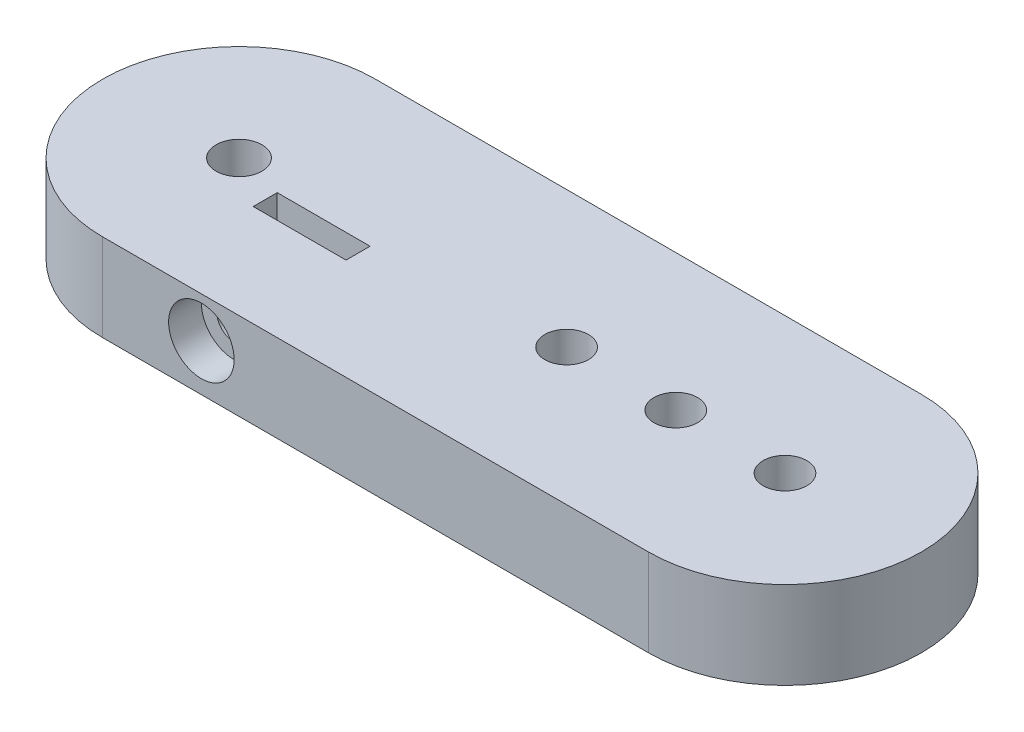
ISO-10303-21;
HEADER;
FILE_DESCRIPTION(('STEP AP214'),'2;1');
FILE_NAME('part.step','',(''),(''),'','','');
FILE_SCHEMA(('AUTOMOTIVE_DESIGN { 1 0 10303 214 1 1 1 1 }'));
ENDSEC;
DATA;
#1=APPLICATION_CONTEXT('core data for automotive mechanical design processes');
#2=APPLICATION_PROTOCOL_DEFINITION('international standard','automotive_design',2000,#1);
#3=PRODUCT_CONTEXT('',#1,'mechanical');
#4=PRODUCT('Part','Part','',(#3));
#5=PRODUCT_RELATED_PRODUCT_CATEGORY('part','',(#4));
#6=PRODUCT_DEFINITION_FORMATION('','',#4);
#7=PRODUCT_DEFINITION_CONTEXT('part definition',#1,'design');
#8=PRODUCT_DEFINITION('design','',#6,#7);
#9=PRODUCT_DEFINITION_SHAPE('','',#8);
#10=(LENGTH_UNIT() NAMED_UNIT(*) SI_UNIT(.MILLI.,.METRE.));
#11=(NAMED_UNIT(*) PLANE_ANGLE_UNIT() SI_UNIT($,.RADIAN.));
#12=(NAMED_UNIT(*) SI_UNIT($,.STERADIAN.) SOLID_ANGLE_UNIT());
#13=UNCERTAINTY_MEASURE_WITH_UNIT(LENGTH_MEASURE(1.E-05),#10,'distance_accuracy_value','');
#14=(GEOMETRIC_REPRESENTATION_CONTEXT(3) GLOBAL_UNCERTAINTY_ASSIGNED_CONTEXT((#13)) GLOBAL_UNIT_ASSIGNED_CONTEXT((#10,
#11,#12)) REPRESENTATION_CONTEXT('',''));
#15=CARTESIAN_POINT('',(0.,0.,0.));
#16=DIRECTION('',(0.,0.,1.));
#17=DIRECTION('',(1.,0.,0.));
#18=AXIS2_PLACEMENT_3D('',#15,#16,#17);
#19=CARTESIAN_POINT('',(9.05188348592834,4.27144827372672,2.5));
#20=DIRECTION('',(0.,0.,1.));
#21=DIRECTION('',(1.,0.,0.));
#22=AXIS2_PLACEMENT_3D('',#19,#20,#21);
#23=CYLINDRICAL_SURFACE('',#22,1.6);
#24=CARTESIAN_POINT('',(9.05188348592834,4.27144827372672,3.2));
#25=DIRECTION('',(0.,0.,-1.));
#26=DIRECTION('',(-1.,0.,0.));
#27=AXIS2_PLACEMENT_3D('',#24,#25,#26);
#28=CIRCLE('',#27,1.6);
#29=CARTESIAN_POINT('',(7.45188348592833,4.27144827372672,3.2));
#30=VERTEX_POINT('',#29);
#31=EDGE_CURVE('E202',#30,#30,#28,.T.);
#32=ORIENTED_EDGE('',*,*,#31,.T.);
#33=EDGE_LOOP('',(#32));
#34=FACE_BOUND('',#33,.T.);
#35=CARTESIAN_POINT('',(9.05188348592834,4.27144827372672,9.5));
#36=DIRECTION('',(0.,0.,1.));
#37=DIRECTION('',(1.,0.,0.));
#38=AXIS2_PLACEMENT_3D('',#35,#36,#37);
#39=CIRCLE('',#38,1.6);
#40=CARTESIAN_POINT('',(10.6518834859283,4.27144827372672,9.5));
#41=VERTEX_POINT('',#40);
#42=EDGE_CURVE('E43',#41,#41,#39,.F.);
#43=ORIENTED_EDGE('',*,*,#42,.F.);
#44=EDGE_LOOP('',(#43));
#45=FACE_BOUND('',#44,.T.);
#46=ADVANCED_FACE('F39',(#34,#45),#23,.F.);
#47=CARTESIAN_POINT('',(0.,8.,0.));
#48=DIRECTION('',(0.,1.,0.));
#49=DIRECTION('',(0.,0.,1.));
#50=AXIS2_PLACEMENT_3D('',#47,#48,#49);
#51=PLANE('',#50);
#52=CARTESIAN_POINT('',(30.,8.,0.));
#53=DIRECTION('',(0.,1.,0.));
#54=DIRECTION('',(0.,0.,1.));
#55=AXIS2_PLACEMENT_3D('',#52,#53,#54);
#56=CIRCLE('',#55,2.);
#57=CARTESIAN_POINT('',(30.,8.,2.));
#58=VERTEX_POINT('',#57);
#59=EDGE_CURVE('E205',#58,#58,#56,.T.);
#60=ORIENTED_EDGE('',*,*,#59,.F.);
#61=EDGE_LOOP('',(#60));
#62=FACE_BOUND('',#61,.T.);
#63=CARTESIAN_POINT('',(40.,8.,0.));
#64=DIRECTION('',(0.,1.,0.));
#65=DIRECTION('',(0.,0.,1.));
#66=AXIS2_PLACEMENT_3D('',#63,#64,#65);
#67=CIRCLE('',#66,2.);
#68=CARTESIAN_POINT('',(40.,8.,2.));
#69=VERTEX_POINT('',#68);
#70=EDGE_CURVE('E229',#69,#69,#67,.T.);
#71=ORIENTED_EDGE('',*,*,#70,.F.);
#72=EDGE_LOOP('',(#71));
#73=FACE_BOUND('',#72,.T.);
#74=DIRECTION('',(0.,0.,1.));
#75=VECTOR('',#74,1.);
#76=CARTESIAN_POINT('',(4.5,8.,3.2));
#77=LINE('',#76,#75);
#78=CARTESIAN_POINT('',(4.5,8.,1.));
#79=VERTEX_POINT('',#78);
#80=CARTESIAN_POINT('',(4.5,8.,3.2));
#81=VERTEX_POINT('',#80);
#82=EDGE_CURVE('E116',#79,#81,#77,.T.);
#83=ORIENTED_EDGE('',*,*,#82,.F.);
#84=DIRECTION('',(-1.,0.,0.));
#85=VECTOR('',#84,1.);
#86=CARTESIAN_POINT('',(4.5,8.,1.));
#87=LINE('',#86,#85);
#88=CARTESIAN_POINT('',(13.,8.,1.));
#89=VERTEX_POINT('',#88);
#90=EDGE_CURVE('E107',#89,#79,#87,.T.);
#91=ORIENTED_EDGE('',*,*,#90,.F.);
#92=DIRECTION('',(0.,0.,-1.));
#93=VECTOR('',#92,1.);
#94=CARTESIAN_POINT('',(13.,8.,1.));
#95=LINE('',#94,#93);
#96=CARTESIAN_POINT('',(13.,8.,3.2));
#97=VERTEX_POINT('',#96);
#98=EDGE_CURVE('E135',#97,#89,#95,.T.);
#99=ORIENTED_EDGE('',*,*,#98,.F.);
#100=DIRECTION('',(1.,0.,0.));
#101=VECTOR('',#100,1.);
#102=CARTESIAN_POINT('',(4.5,8.,3.2));
#103=LINE('',#102,#101);
#104=EDGE_CURVE('E131',#81,#97,#103,.T.);
#105=ORIENTED_EDGE('',*,*,#104,.F.);
#106=EDGE_LOOP('',(#83,#91,#99,#105));
#107=FACE_BOUND('',#106,.T.);
#108=CARTESIAN_POINT('',(0.,8.,0.));
#109=DIRECTION('',(0.,1.,0.));
#110=DIRECTION('',(0.,0.,1.));
#111=AXIS2_PLACEMENT_3D('',#108,#109,#110);
#112=CIRCLE('',#111,2.1);
#113=CARTESIAN_POINT('',(0.,8.,2.1));
#114=VERTEX_POINT('',#113);
#115=EDGE_CURVE('E159',#114,#114,#112,.T.);
#116=ORIENTED_EDGE('',*,*,#115,.F.);
#117=EDGE_LOOP('',(#116));
#118=FACE_BOUND('',#117,.T.);
#119=CARTESIAN_POINT('',(0.,8.,0.));
#120=DIRECTION('',(0.,1.,0.));
#121=DIRECTION('',(0.,0.,1.));
#122=AXIS2_PLACEMENT_3D('',#119,#120,#121);
#123=CIRCLE('',#122,12.5);
#124=CARTESIAN_POINT('',(0.,8.,-12.5));
#125=VERTEX_POINT('',#124);
#126=CARTESIAN_POINT('',(0.,8.,12.5));
#127=VERTEX_POINT('',#126);
#128=EDGE_CURVE('E167',#125,#127,#123,.T.);
#129=ORIENTED_EDGE('',*,*,#128,.T.);
#130=DIRECTION('',(1.,0.,0.));
#131=VECTOR('',#130,1.);
#132=CARTESIAN_POINT('',(0.,8.,12.5));
#133=LINE('',#132,#131);
#134=CARTESIAN_POINT('',(50.,8.,12.5));
#135=VERTEX_POINT('',#134);
#136=EDGE_CURVE('E171',#127,#135,#133,.T.);
#137=ORIENTED_EDGE('',*,*,#136,.T.);
#138=CARTESIAN_POINT('',(50.,8.,0.));
#139=DIRECTION('',(0.,1.,0.));
#140=DIRECTION('',(0.,0.,1.));
#141=AXIS2_PLACEMENT_3D('',#138,#139,#140);
#142=CIRCLE('',#141,12.5);
#143=CARTESIAN_POINT('',(50.,8.,-12.5));
#144=VERTEX_POINT('',#143);
#145=EDGE_CURVE('E175',#135,#144,#142,.T.);
#146=ORIENTED_EDGE('',*,*,#145,.T.);
#147=DIRECTION('',(-1.,0.,0.));
#148=VECTOR('',#147,1.);
#149=CARTESIAN_POINT('',(0.,8.,-12.5));
#150=LINE('',#149,#148);
#151=EDGE_CURVE('E178',#144,#125,#150,.T.);
#152=ORIENTED_EDGE('',*,*,#151,.T.);
#153=EDGE_LOOP('',(#129,#137,#146,#152));
#154=FACE_BOUND('',#153,.T.);
#155=CARTESIAN_POINT('',(50.,8.,0.));
#156=DIRECTION('',(0.,1.,0.));
#157=DIRECTION('',(0.,0.,1.));
#158=AXIS2_PLACEMENT_3D('',#155,#156,#157);
#159=CIRCLE('',#158,2.);
#160=CARTESIAN_POINT('',(50.,8.,2.));
#161=VERTEX_POINT('',#160);
#162=EDGE_CURVE('E143',#161,#161,#159,.T.);
#163=ORIENTED_EDGE('',*,*,#162,.F.);
#164=EDGE_LOOP('',(#163));
#165=FACE_BOUND('',#164,.T.);
#166=ADVANCED_FACE('F129',(#62,#73,#107,#118,#154,#165),#51,.T.);
#167=CARTESIAN_POINT('',(0.,0.,0.));
#168=DIRECTION('',(0.,1.,0.));
#169=DIRECTION('',(0.,0.,1.));
#170=AXIS2_PLACEMENT_3D('',#167,#168,#169);
#171=PLANE('',#170);
#172=CARTESIAN_POINT('',(30.,0.,0.));
#173=DIRECTION('',(0.,1.,0.));
#174=DIRECTION('',(0.,0.,1.));
#175=AXIS2_PLACEMENT_3D('',#172,#173,#174);
#176=CIRCLE('',#175,2.);
#177=CARTESIAN_POINT('',(30.,0.,2.));
#178=VERTEX_POINT('',#177);
#179=EDGE_CURVE('E211',#178,#178,#176,.T.);
#180=ORIENTED_EDGE('',*,*,#179,.T.);
#181=EDGE_LOOP('',(#180));
#182=FACE_BOUND('',#181,.T.);
#183=CARTESIAN_POINT('',(40.,0.,0.));
#184=DIRECTION('',(0.,1.,0.));
#185=DIRECTION('',(0.,0.,1.));
#186=AXIS2_PLACEMENT_3D('',#183,#184,#185);
#187=CIRCLE('',#186,2.);
#188=CARTESIAN_POINT('',(40.,0.,2.));
#189=VERTEX_POINT('',#188);
#190=EDGE_CURVE('E231',#189,#189,#187,.T.);
#191=ORIENTED_EDGE('',*,*,#190,.T.);
#192=EDGE_LOOP('',(#191));
#193=FACE_BOUND('',#192,.T.);
#194=CARTESIAN_POINT('',(0.,0.,0.));
#195=DIRECTION('',(0.,1.,0.));
#196=DIRECTION('',(0.,0.,1.));
#197=AXIS2_PLACEMENT_3D('',#194,#195,#196);
#198=CIRCLE('',#197,2.1);
#199=CARTESIAN_POINT('',(0.,0.,2.1));
#200=VERTEX_POINT('',#199);
#201=EDGE_CURVE('E125',#200,#200,#198,.T.);
#202=ORIENTED_EDGE('',*,*,#201,.T.);
#203=EDGE_LOOP('',(#202));
#204=FACE_BOUND('',#203,.T.);
#205=CARTESIAN_POINT('',(0.,0.,0.));
#206=DIRECTION('',(0.,1.,0.));
#207=DIRECTION('',(0.,0.,1.));
#208=AXIS2_PLACEMENT_3D('',#205,#206,#207);
#209=CIRCLE('',#208,12.5);
#210=CARTESIAN_POINT('',(0.,0.,-12.5));
#211=VERTEX_POINT('',#210);
#212=CARTESIAN_POINT('',(0.,0.,12.5));
#213=VERTEX_POINT('',#212);
#214=EDGE_CURVE('E163',#211,#213,#209,.T.);
#215=ORIENTED_EDGE('',*,*,#214,.F.);
#216=DIRECTION('',(-1.,0.,0.));
#217=VECTOR('',#216,1.);
#218=CARTESIAN_POINT('',(0.,0.,-12.5));
#219=LINE('',#218,#217);
#220=CARTESIAN_POINT('',(50.,0.,-12.5));
#221=VERTEX_POINT('',#220);
#222=EDGE_CURVE('E172',#221,#211,#219,.T.);
#223=ORIENTED_EDGE('',*,*,#222,.F.);
#224=CARTESIAN_POINT('',(50.,0.,0.));
#225=DIRECTION('',(0.,1.,0.));
#226=DIRECTION('',(0.,0.,1.));
#227=AXIS2_PLACEMENT_3D('',#224,#225,#226);
#228=CIRCLE('',#227,12.5);
#229=CARTESIAN_POINT('',(50.,0.,12.5));
#230=VERTEX_POINT('',#229);
#231=EDGE_CURVE('E188',#230,#221,#228,.T.);
#232=ORIENTED_EDGE('',*,*,#231,.F.);
#233=DIRECTION('',(1.,0.,0.));
#234=VECTOR('',#233,1.);
#235=CARTESIAN_POINT('',(0.,0.,12.5));
#236=LINE('',#235,#234);
#237=EDGE_CURVE('E185',#213,#230,#236,.T.);
#238=ORIENTED_EDGE('',*,*,#237,.F.);
#239=EDGE_LOOP('',(#215,#223,#232,#238));
#240=FACE_BOUND('',#239,.T.);
#241=DIRECTION('',(-1.,0.,0.));
#242=VECTOR('',#241,1.);
#243=CARTESIAN_POINT('',(4.5,0.,1.));
#244=LINE('',#243,#242);
#245=CARTESIAN_POINT('',(13.,0.,1.));
#246=VERTEX_POINT('',#245);
#247=CARTESIAN_POINT('',(4.5,0.,1.));
#248=VERTEX_POINT('',#247);
#249=EDGE_CURVE('E65',#246,#248,#244,.T.);
#250=ORIENTED_EDGE('',*,*,#249,.T.);
#251=DIRECTION('',(0.,0.,1.));
#252=VECTOR('',#251,1.);
#253=CARTESIAN_POINT('',(4.5,0.,3.2));
#254=LINE('',#253,#252);
#255=CARTESIAN_POINT('',(4.5,0.,3.2));
#256=VERTEX_POINT('',#255);
#257=EDGE_CURVE('E123',#248,#256,#254,.T.);
#258=ORIENTED_EDGE('',*,*,#257,.T.);
#259=DIRECTION('',(1.,0.,0.));
#260=VECTOR('',#259,1.);
#261=CARTESIAN_POINT('',(4.5,0.,3.2));
#262=LINE('',#261,#260);
#263=CARTESIAN_POINT('',(13.,0.,3.2));
#264=VERTEX_POINT('',#263);
#265=EDGE_CURVE('E146',#256,#264,#262,.T.);
#266=ORIENTED_EDGE('',*,*,#265,.T.);
#267=DIRECTION('',(0.,0.,-1.));
#268=VECTOR('',#267,1.);
#269=CARTESIAN_POINT('',(13.,0.,1.));
#270=LINE('',#269,#268);
#271=EDGE_CURVE('E117',#264,#246,#270,.T.);
#272=ORIENTED_EDGE('',*,*,#271,.T.);
#273=EDGE_LOOP('',(#250,#258,#266,#272));
#274=FACE_BOUND('',#273,.T.);
#275=CARTESIAN_POINT('',(50.,0.,0.));
#276=DIRECTION('',(0.,1.,0.));
#277=DIRECTION('',(0.,0.,1.));
#278=AXIS2_PLACEMENT_3D('',#275,#276,#277);
#279=CIRCLE('',#278,2.);
#280=CARTESIAN_POINT('',(50.,0.,2.));
#281=VERTEX_POINT('',#280);
#282=EDGE_CURVE('E235',#281,#281,#279,.T.);
#283=ORIENTED_EDGE('',*,*,#282,.T.);
#284=EDGE_LOOP('',(#283));
#285=FACE_BOUND('',#284,.T.);
#286=ADVANCED_FACE('F245',(#182,#193,#204,#240,#274,#285),#171,.F.);
#287=CARTESIAN_POINT('',(0.,8.,0.));
#288=DIRECTION('',(0.,-1.,0.));
#289=DIRECTION('',(0.,0.,-1.));
#290=AXIS2_PLACEMENT_3D('',#287,#288,#289);
#291=CYLINDRICAL_SURFACE('',#290,12.5);
#292=ORIENTED_EDGE('',*,*,#214,.T.);
#293=DIRECTION('',(0.,-1.,0.));
#294=VECTOR('',#293,1.);
#295=CARTESIAN_POINT('',(0.,8.,12.5));
#296=LINE('',#295,#294);
#297=EDGE_CURVE('E11',#127,#213,#296,.T.);
#298=ORIENTED_EDGE('',*,*,#297,.F.);
#299=ORIENTED_EDGE('',*,*,#128,.F.);
#300=DIRECTION('',(0.,-1.,0.));
#301=VECTOR('',#300,1.);
#302=CARTESIAN_POINT('',(0.,8.,-12.5));
#303=LINE('',#302,#301);
#304=EDGE_CURVE('E181',#125,#211,#303,.T.);
#305=ORIENTED_EDGE('',*,*,#304,.T.);
#306=EDGE_LOOP('',(#292,#298,#299,#305));
#307=FACE_BOUND('',#306,.T.);
#308=ADVANCED_FACE('F41',(#307),#291,.T.);
#309=CARTESIAN_POINT('',(0.,8.,12.5));
#310=DIRECTION('',(0.,0.,-1.));
#311=DIRECTION('',(-1.,0.,0.));
#312=AXIS2_PLACEMENT_3D('',#309,#310,#311);
#313=PLANE('',#312);
#314=CARTESIAN_POINT('',(9.05188348592834,4.27144827372672,12.5));
#315=DIRECTION('',(0.,0.,1.));
#316=DIRECTION('',(1.,0.,0.));
#317=AXIS2_PLACEMENT_3D('',#314,#315,#316);
#318=CIRCLE('',#317,3.);
#319=CARTESIAN_POINT('',(12.0518834859283,4.27144827372672,12.5));
#320=VERTEX_POINT('',#319);
#321=EDGE_CURVE('E219',#320,#320,#318,.T.);
#322=ORIENTED_EDGE('',*,*,#321,.F.);
#323=EDGE_LOOP('',(#322));
#324=FACE_BOUND('',#323,.T.);
#325=ORIENTED_EDGE('',*,*,#237,.T.);
#326=DIRECTION('',(0.,-1.,0.));
#327=VECTOR('',#326,1.);
#328=CARTESIAN_POINT('',(50.,8.,12.5));
#329=LINE('',#328,#327);
#330=EDGE_CURVE('E49',#135,#230,#329,.T.);
#331=ORIENTED_EDGE('',*,*,#330,.F.);
#332=ORIENTED_EDGE('',*,*,#136,.F.);
#333=ORIENTED_EDGE('',*,*,#297,.T.);
#334=EDGE_LOOP('',(#325,#331,#332,#333));
#335=FACE_BOUND('',#334,.T.);
#336=ADVANCED_FACE('F319',(#324,#335),#313,.F.);
#337=CARTESIAN_POINT('',(50.,8.,0.));
#338=DIRECTION('',(0.,-1.,0.));
#339=DIRECTION('',(0.,0.,-1.));
#340=AXIS2_PLACEMENT_3D('',#337,#338,#339);
#341=CYLINDRICAL_SURFACE('',#340,12.5);
#342=ORIENTED_EDGE('',*,*,#231,.T.);
#343=DIRECTION('',(0.,-1.,0.));
#344=VECTOR('',#343,1.);
#345=CARTESIAN_POINT('',(50.,8.,-12.5));
#346=LINE('',#345,#344);
#347=EDGE_CURVE('E196',#144,#221,#346,.T.);
#348=ORIENTED_EDGE('',*,*,#347,.F.);
#349=ORIENTED_EDGE('',*,*,#145,.F.);
#350=ORIENTED_EDGE('',*,*,#330,.T.);
#351=EDGE_LOOP('',(#342,#348,#349,#350));
#352=FACE_BOUND('',#351,.T.);
#353=ADVANCED_FACE('F316',(#352),#341,.T.);
#354=CARTESIAN_POINT('',(0.,8.,-12.5));
#355=DIRECTION('',(0.,0.,1.));
#356=DIRECTION('',(1.,0.,0.));
#357=AXIS2_PLACEMENT_3D('',#354,#355,#356);
#358=PLANE('',#357);
#359=ORIENTED_EDGE('',*,*,#222,.T.);
#360=ORIENTED_EDGE('',*,*,#304,.F.);
#361=ORIENTED_EDGE('',*,*,#151,.F.);
#362=ORIENTED_EDGE('',*,*,#347,.T.);
#363=EDGE_LOOP('',(#359,#360,#361,#362));
#364=FACE_BOUND('',#363,.T.);
#365=ADVANCED_FACE('F311',(#364),#358,.F.);
#366=CARTESIAN_POINT('',(0.,8.,0.));
#367=DIRECTION('',(0.,-1.,0.));
#368=DIRECTION('',(0.,0.,-1.));
#369=AXIS2_PLACEMENT_3D('',#366,#367,#368);
#370=CYLINDRICAL_SURFACE('',#369,2.1);
#371=ORIENTED_EDGE('',*,*,#115,.T.);
#372=EDGE_LOOP('',(#371));
#373=FACE_BOUND('',#372,.T.);
#374=ORIENTED_EDGE('',*,*,#201,.F.);
#375=EDGE_LOOP('',(#374));
#376=FACE_BOUND('',#375,.T.);
#377=ADVANCED_FACE('F309',(#373,#376),#370,.F.);
#378=CARTESIAN_POINT('',(4.5,8.,1.));
#379=DIRECTION('',(0.,0.,1.));
#380=DIRECTION('',(1.,0.,0.));
#381=AXIS2_PLACEMENT_3D('',#378,#379,#380);
#382=PLANE('',#381);
#383=ORIENTED_EDGE('',*,*,#249,.F.);
#384=DIRECTION('',(0.,-1.,0.));
#385=VECTOR('',#384,1.);
#386=CARTESIAN_POINT('',(13.,8.,1.));
#387=LINE('',#386,#385);
#388=EDGE_CURVE('E111',#89,#246,#387,.T.);
#389=ORIENTED_EDGE('',*,*,#388,.F.);
#390=ORIENTED_EDGE('',*,*,#90,.T.);
#391=DIRECTION('',(0.,-1.,0.));
#392=VECTOR('',#391,1.);
#393=CARTESIAN_POINT('',(4.5,8.,1.));
#394=LINE('',#393,#392);
#395=EDGE_CURVE('E110',#79,#248,#394,.T.);
#396=ORIENTED_EDGE('',*,*,#395,.T.);
#397=EDGE_LOOP('',(#383,#389,#390,#396));
#398=FACE_BOUND('',#397,.T.);
#399=ADVANCED_FACE('F109',(#398),#382,.T.);
#400=CARTESIAN_POINT('',(4.5,8.,3.2));
#401=DIRECTION('',(1.,0.,0.));
#402=DIRECTION('',(0.,0.,-1.));
#403=AXIS2_PLACEMENT_3D('',#400,#401,#402);
#404=PLANE('',#403);
#405=ORIENTED_EDGE('',*,*,#257,.F.);
#406=ORIENTED_EDGE('',*,*,#395,.F.);
#407=ORIENTED_EDGE('',*,*,#82,.T.);
#408=DIRECTION('',(0.,-1.,0.));
#409=VECTOR('',#408,1.);
#410=CARTESIAN_POINT('',(4.5,8.,3.2));
#411=LINE('',#410,#409);
#412=EDGE_CURVE('E126',#81,#256,#411,.T.);
#413=ORIENTED_EDGE('',*,*,#412,.T.);
#414=EDGE_LOOP('',(#405,#406,#407,#413));
#415=FACE_BOUND('',#414,.T.);
#416=ADVANCED_FACE('F120',(#415),#404,.T.);
#417=CARTESIAN_POINT('',(4.5,8.,3.2));
#418=DIRECTION('',(0.,0.,-1.));
#419=DIRECTION('',(-1.,0.,0.));
#420=AXIS2_PLACEMENT_3D('',#417,#418,#419);
#421=PLANE('',#420);
#422=ORIENTED_EDGE('',*,*,#31,.F.);
#423=EDGE_LOOP('',(#422));
#424=FACE_BOUND('',#423,.T.);
#425=ORIENTED_EDGE('',*,*,#265,.F.);
#426=ORIENTED_EDGE('',*,*,#412,.F.);
#427=ORIENTED_EDGE('',*,*,#104,.T.);
#428=DIRECTION('',(0.,-1.,0.));
#429=VECTOR('',#428,1.);
#430=CARTESIAN_POINT('',(13.,8.,3.2));
#431=LINE('',#430,#429);
#432=EDGE_CURVE('E57',#97,#264,#431,.T.);
#433=ORIENTED_EDGE('',*,*,#432,.T.);
#434=EDGE_LOOP('',(#425,#426,#427,#433));
#435=FACE_BOUND('',#434,.T.);
#436=ADVANCED_FACE('F260',(#424,#435),#421,.T.);
#437=CARTESIAN_POINT('',(13.,8.,1.));
#438=DIRECTION('',(-1.,0.,0.));
#439=DIRECTION('',(0.,0.,1.));
#440=AXIS2_PLACEMENT_3D('',#437,#438,#439);
#441=PLANE('',#440);
#442=ORIENTED_EDGE('',*,*,#271,.F.);
#443=ORIENTED_EDGE('',*,*,#432,.F.);
#444=ORIENTED_EDGE('',*,*,#98,.T.);
#445=ORIENTED_EDGE('',*,*,#388,.T.);
#446=EDGE_LOOP('',(#442,#443,#444,#445));
#447=FACE_BOUND('',#446,.T.);
#448=ADVANCED_FACE('F250',(#447),#441,.T.);
#449=CARTESIAN_POINT('',(50.,8.,0.));
#450=DIRECTION('',(0.,-1.,0.));
#451=DIRECTION('',(0.,0.,-1.));
#452=AXIS2_PLACEMENT_3D('',#449,#450,#451);
#453=CYLINDRICAL_SURFACE('',#452,2.);
#454=ORIENTED_EDGE('',*,*,#162,.T.);
#455=EDGE_LOOP('',(#454));
#456=FACE_BOUND('',#455,.T.);
#457=ORIENTED_EDGE('',*,*,#282,.F.);
#458=EDGE_LOOP('',(#457));
#459=FACE_BOUND('',#458,.T.);
#460=ADVANCED_FACE('F247',(#456,#459),#453,.F.);
#461=CARTESIAN_POINT('',(40.,0.,0.));
#462=DIRECTION('',(0.,1.,0.));
#463=DIRECTION('',(0.,0.,1.));
#464=AXIS2_PLACEMENT_3D('',#461,#462,#463);
#465=CYLINDRICAL_SURFACE('',#464,2.);
#466=ORIENTED_EDGE('',*,*,#190,.F.);
#467=EDGE_LOOP('',(#466));
#468=FACE_BOUND('',#467,.T.);
#469=ORIENTED_EDGE('',*,*,#70,.T.);
#470=EDGE_LOOP('',(#469));
#471=FACE_BOUND('',#470,.T.);
#472=ADVANCED_FACE('F249',(#468,#471),#465,.F.);
#473=CARTESIAN_POINT('',(30.,0.,0.));
#474=DIRECTION('',(0.,1.,0.));
#475=DIRECTION('',(0.,0.,1.));
#476=AXIS2_PLACEMENT_3D('',#473,#474,#475);
#477=CYLINDRICAL_SURFACE('',#476,2.);
#478=ORIENTED_EDGE('',*,*,#179,.F.);
#479=EDGE_LOOP('',(#478));
#480=FACE_BOUND('',#479,.T.);
#481=ORIENTED_EDGE('',*,*,#59,.T.);
#482=EDGE_LOOP('',(#481));
#483=FACE_BOUND('',#482,.T.);
#484=ADVANCED_FACE('F257',(#480,#483),#477,.F.);
#485=CARTESIAN_POINT('',(9.05188348592834,4.27144827372672,9.5));
#486=DIRECTION('',(0.,0.,1.));
#487=DIRECTION('',(1.,0.,0.));
#488=AXIS2_PLACEMENT_3D('',#485,#486,#487);
#489=PLANE('',#488);
#490=CARTESIAN_POINT('',(9.05188348592834,4.27144827372672,9.5));
#491=DIRECTION('',(0.,0.,1.));
#492=DIRECTION('',(1.,0.,0.));
#493=AXIS2_PLACEMENT_3D('',#490,#491,#492);
#494=CIRCLE('',#493,3.);
#495=CARTESIAN_POINT('',(12.0518834859283,4.27144827372672,9.5));
#496=VERTEX_POINT('',#495);
#497=EDGE_CURVE('E214',#496,#496,#494,.T.);
#498=ORIENTED_EDGE('',*,*,#497,.T.);
#499=EDGE_LOOP('',(#498));
#500=FACE_BOUND('',#499,.T.);
#501=ORIENTED_EDGE('',*,*,#42,.T.);
#502=EDGE_LOOP('',(#501));
#503=FACE_BOUND('',#502,.T.);
#504=ADVANCED_FACE('F275',(#500,#503),#489,.T.);
#505=CARTESIAN_POINT('',(9.05188348592834,4.27144827372672,9.5));
#506=DIRECTION('',(0.,0.,1.));
#507=DIRECTION('',(1.,0.,0.));
#508=AXIS2_PLACEMENT_3D('',#505,#506,#507);
#509=CYLINDRICAL_SURFACE('',#508,3.);
#510=ORIENTED_EDGE('',*,*,#497,.F.);
#511=EDGE_LOOP('',(#510));
#512=FACE_BOUND('',#511,.T.);
#513=ORIENTED_EDGE('',*,*,#321,.T.);
#514=EDGE_LOOP('',(#513));
#515=FACE_BOUND('',#514,.T.);
#516=ADVANCED_FACE('F272',(#512,#515),#509,.F.);
#517=CLOSED_SHELL('',(#46,#166,#286,#308,#336,#353,#365,#377,#399,#416,#436,#448,#460,#472,#484,
#504,#516));
#518=MANIFOLD_SOLID_BREP('B2',#517);
#519=ADVANCED_BREP_SHAPE_REPRESENTATION('',(#18,#518),#14);
#520=SHAPE_DEFINITION_REPRESENTATION(#9,#519);
ENDSEC;
END-ISO-10303-21;
